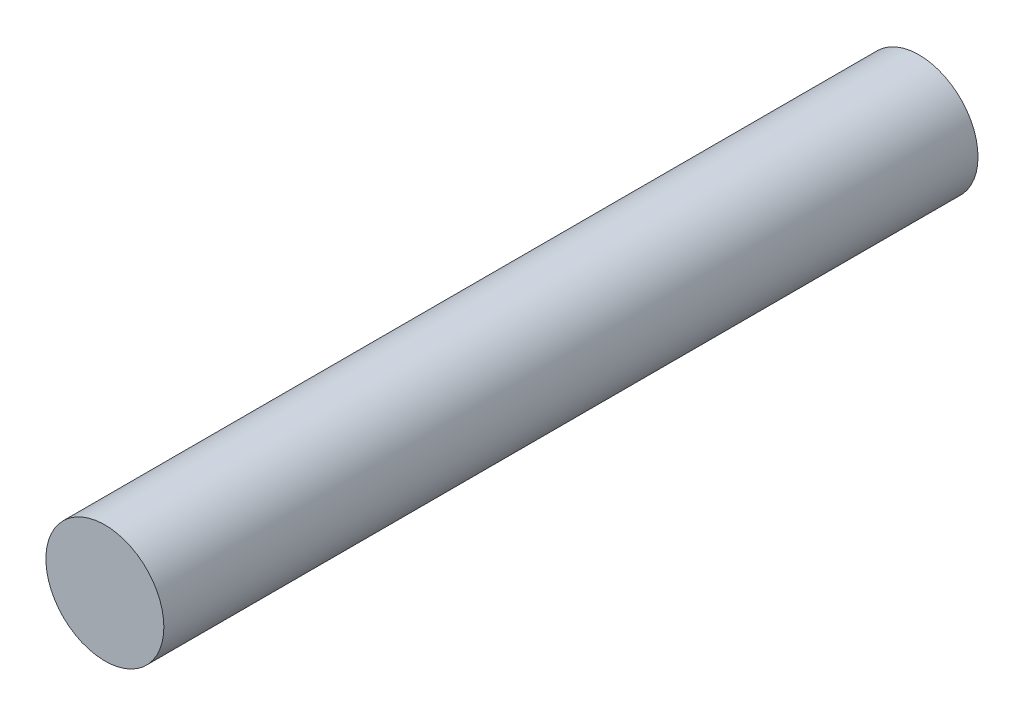
ISO-10303-21;
HEADER;
FILE_DESCRIPTION(('STEP AP214'),'2;1');
FILE_NAME('part.step','',(''),(''),'','','');
FILE_SCHEMA(('AUTOMOTIVE_DESIGN { 1 0 10303 214 1 1 1 1 }'));
ENDSEC;
DATA;
#1=APPLICATION_CONTEXT('core data for automotive mechanical design processes');
#2=APPLICATION_PROTOCOL_DEFINITION('international standard','automotive_design',2000,#1);
#3=PRODUCT_CONTEXT('',#1,'mechanical');
#4=PRODUCT('Part','Part','',(#3));
#5=PRODUCT_RELATED_PRODUCT_CATEGORY('part','',(#4));
#6=PRODUCT_DEFINITION_FORMATION('','',#4);
#7=PRODUCT_DEFINITION_CONTEXT('part definition',#1,'design');
#8=PRODUCT_DEFINITION('design','',#6,#7);
#9=PRODUCT_DEFINITION_SHAPE('','',#8);
#10=(LENGTH_UNIT() NAMED_UNIT(*) SI_UNIT(.MILLI.,.METRE.));
#11=(NAMED_UNIT(*) PLANE_ANGLE_UNIT() SI_UNIT($,.RADIAN.));
#12=(NAMED_UNIT(*) SI_UNIT($,.STERADIAN.) SOLID_ANGLE_UNIT());
#13=UNCERTAINTY_MEASURE_WITH_UNIT(LENGTH_MEASURE(1.E-05),#10,'distance_accuracy_value','');
#14=(GEOMETRIC_REPRESENTATION_CONTEXT(3) GLOBAL_UNCERTAINTY_ASSIGNED_CONTEXT((#13)) GLOBAL_UNIT_ASSIGNED_CONTEXT((#10,
#11,#12)) REPRESENTATION_CONTEXT('',''));
#15=CARTESIAN_POINT('',(0.,0.,0.));
#16=DIRECTION('',(0.,0.,1.));
#17=DIRECTION('',(1.,0.,0.));
#18=AXIS2_PLACEMENT_3D('',#15,#16,#17);
#19=CARTESIAN_POINT('',(0.,0.,701.2));
#20=DIRECTION('',(0.,0.,-1.));
#21=DIRECTION('',(-1.,0.,0.));
#22=AXIS2_PLACEMENT_3D('',#19,#20,#21);
#23=CYLINDRICAL_SURFACE('',#22,50.8);
#24=CARTESIAN_POINT('',(0.,0.,701.2));
#25=DIRECTION('',(0.,0.,1.));
#26=DIRECTION('',(1.,0.,0.));
#27=AXIS2_PLACEMENT_3D('',#24,#25,#26);
#28=CIRCLE('',#27,50.8);
#29=CARTESIAN_POINT('',(50.8,0.,701.2));
#30=VERTEX_POINT('',#29);
#31=EDGE_CURVE('E10',#30,#30,#28,.T.);
#32=ORIENTED_EDGE('',*,*,#31,.F.);
#33=EDGE_LOOP('',(#32));
#34=FACE_BOUND('',#33,.T.);
#35=CARTESIAN_POINT('',(0.,0.,0.));
#36=DIRECTION('',(0.,0.,1.));
#37=DIRECTION('',(1.,0.,0.));
#38=AXIS2_PLACEMENT_3D('',#35,#36,#37);
#39=CIRCLE('',#38,50.8);
#40=CARTESIAN_POINT('',(50.8,0.,0.));
#41=VERTEX_POINT('',#40);
#42=EDGE_CURVE('E38',#41,#41,#39,.T.);
#43=ORIENTED_EDGE('',*,*,#42,.T.);
#44=EDGE_LOOP('',(#43));
#45=FACE_BOUND('',#44,.T.);
#46=ADVANCED_FACE('F35',(#34,#45),#23,.T.);
#47=CARTESIAN_POINT('',(0.,0.,701.2));
#48=DIRECTION('',(0.,0.,1.));
#49=DIRECTION('',(1.,0.,0.));
#50=AXIS2_PLACEMENT_3D('',#47,#48,#49);
#51=PLANE('',#50);
#52=ORIENTED_EDGE('',*,*,#31,.T.);
#53=EDGE_LOOP('',(#52));
#54=FACE_BOUND('',#53,.T.);
#55=ADVANCED_FACE('F50',(#54),#51,.T.);
#56=CARTESIAN_POINT('',(0.,0.,0.));
#57=DIRECTION('',(0.,0.,1.));
#58=DIRECTION('',(1.,0.,0.));
#59=AXIS2_PLACEMENT_3D('',#56,#57,#58);
#60=PLANE('',#59);
#61=ORIENTED_EDGE('',*,*,#42,.F.);
#62=EDGE_LOOP('',(#61));
#63=FACE_BOUND('',#62,.T.);
#64=ADVANCED_FACE('F48',(#63),#60,.F.);
#65=CLOSED_SHELL('',(#46,#55,#64));
#66=MANIFOLD_SOLID_BREP('B2',#65);
#67=ADVANCED_BREP_SHAPE_REPRESENTATION('',(#18,#66),#14);
#68=SHAPE_DEFINITION_REPRESENTATION(#9,#67);
ENDSEC;
END-ISO-10303-21;
